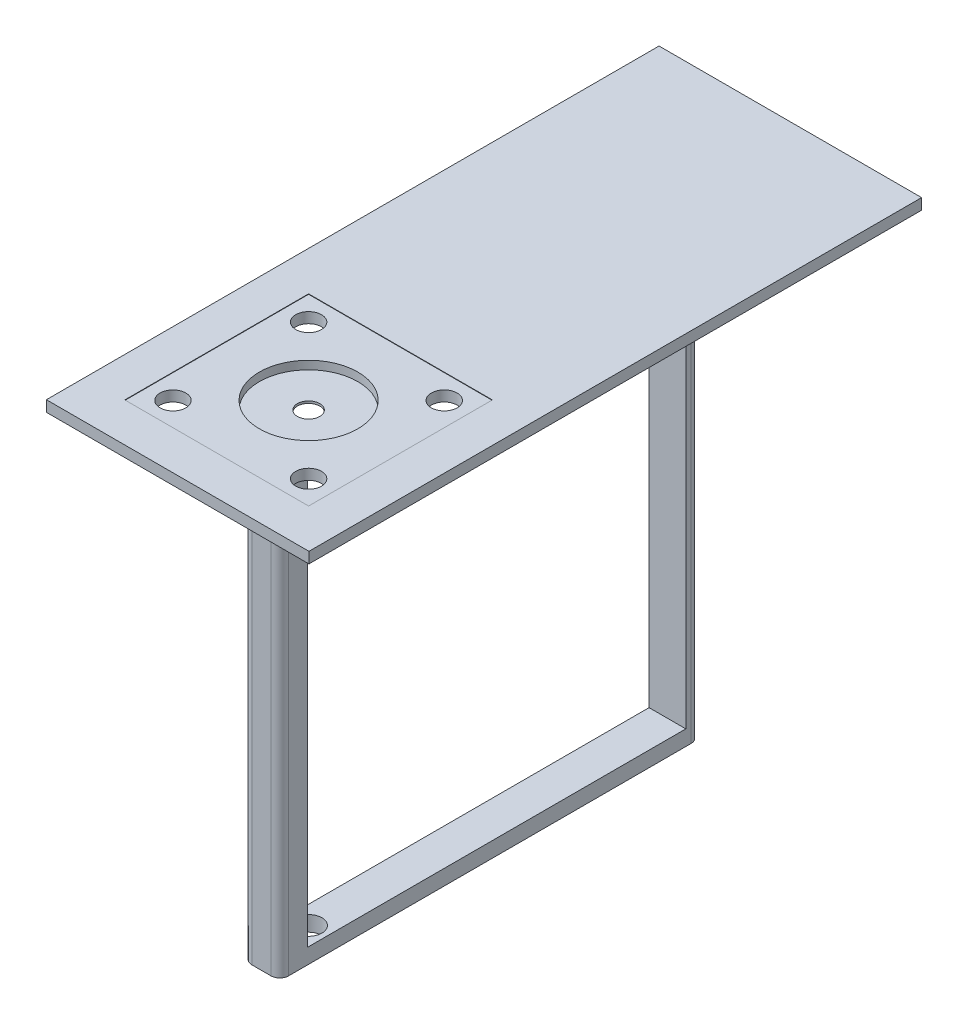
ISO-10303-21;
HEADER;
FILE_DESCRIPTION(('STEP AP214'),'2;1');
FILE_NAME('part.step','',(''),(''),'','','');
FILE_SCHEMA(('AUTOMOTIVE_DESIGN { 1 0 10303 214 1 1 1 1 }'));
ENDSEC;
DATA;
#1=APPLICATION_CONTEXT('core data for automotive mechanical design processes');
#2=APPLICATION_PROTOCOL_DEFINITION('international standard','automotive_design',2000,#1);
#3=PRODUCT_CONTEXT('',#1,'mechanical');
#4=PRODUCT('Part','Part','',(#3));
#5=PRODUCT_RELATED_PRODUCT_CATEGORY('part','',(#4));
#6=PRODUCT_DEFINITION_FORMATION('','',#4);
#7=PRODUCT_DEFINITION_CONTEXT('part definition',#1,'design');
#8=PRODUCT_DEFINITION('design','',#6,#7);
#9=PRODUCT_DEFINITION_SHAPE('','',#8);
#10=(LENGTH_UNIT() NAMED_UNIT(*) SI_UNIT(.MILLI.,.METRE.));
#11=(NAMED_UNIT(*) PLANE_ANGLE_UNIT() SI_UNIT($,.RADIAN.));
#12=(NAMED_UNIT(*) SI_UNIT($,.STERADIAN.) SOLID_ANGLE_UNIT());
#13=UNCERTAINTY_MEASURE_WITH_UNIT(LENGTH_MEASURE(1.E-05),#10,'distance_accuracy_value','');
#14=(GEOMETRIC_REPRESENTATION_CONTEXT(3) GLOBAL_UNCERTAINTY_ASSIGNED_CONTEXT((#13)) GLOBAL_UNIT_ASSIGNED_CONTEXT((#10,
#11,#12)) REPRESENTATION_CONTEXT('',''));
#15=CARTESIAN_POINT('',(0.,0.,0.));
#16=DIRECTION('',(0.,0.,1.));
#17=DIRECTION('',(1.,0.,0.));
#18=AXIS2_PLACEMENT_3D('',#15,#16,#17);
#19=CARTESIAN_POINT('',(-27.8,-26.25,-113.118467464147));
#20=DIRECTION('',(0.,-1.,0.));
#21=DIRECTION('',(0.,0.,-1.));
#22=AXIS2_PLACEMENT_3D('',#19,#20,#21);
#23=CYLINDRICAL_SURFACE('',#22,2.);
#24=CARTESIAN_POINT('',(-27.8,-105.,-113.118467464147));
#25=DIRECTION('',(0.,1.,0.));
#26=DIRECTION('',(1.,0.,0.));
#27=AXIS2_PLACEMENT_3D('',#24,#25,#26);
#28=CIRCLE('',#27,2.);
#29=CARTESIAN_POINT('',(-25.8,-105.,-113.118467464147));
#30=VERTEX_POINT('',#29);
#31=CARTESIAN_POINT('',(-27.8,-105.,-115.118467464147));
#32=VERTEX_POINT('',#31);
#33=EDGE_CURVE('E9',#30,#32,#28,.T.);
#34=ORIENTED_EDGE('',*,*,#33,.T.);
#35=DIRECTION('',(0.,1.,0.));
#36=VECTOR('',#35,1.);
#37=CARTESIAN_POINT('',(-27.8,-26.25,-115.118467464147));
#38=LINE('',#37,#36);
#39=CARTESIAN_POINT('',(-27.8,0.,-115.118467464147));
#40=VERTEX_POINT('',#39);
#41=EDGE_CURVE('E25',#32,#40,#38,.T.);
#42=ORIENTED_EDGE('',*,*,#41,.T.);
#43=CARTESIAN_POINT('',(-27.8,0.,-113.118467464147));
#44=DIRECTION('',(0.,-1.,0.));
#45=DIRECTION('',(1.,0.,0.));
#46=AXIS2_PLACEMENT_3D('',#43,#44,#45);
#47=CIRCLE('',#46,2.);
#48=CARTESIAN_POINT('',(-25.8,0.,-113.118467464147));
#49=VERTEX_POINT('',#48);
#50=EDGE_CURVE('E264',#40,#49,#47,.T.);
#51=ORIENTED_EDGE('',*,*,#50,.T.);
#52=DIRECTION('',(0.,-1.,0.));
#53=VECTOR('',#52,1.);
#54=CARTESIAN_POINT('',(-25.8,-26.25,-113.118467464147));
#55=LINE('',#54,#53);
#56=EDGE_CURVE('E481',#49,#30,#55,.T.);
#57=ORIENTED_EDGE('',*,*,#56,.T.);
#58=EDGE_LOOP('',(#34,#42,#51,#57));
#59=FACE_BOUND('',#58,.T.);
#60=ADVANCED_FACE('F15',(#59),#23,.T.);
#61=CARTESIAN_POINT('',(-33.2,0.,-115.118467464147));
#62=DIRECTION('',(0.,0.,-1.));
#63=DIRECTION('',(-1.,0.,0.));
#64=AXIS2_PLACEMENT_3D('',#61,#62,#63);
#65=PLANE('',#64);
#66=ORIENTED_EDGE('',*,*,#41,.F.);
#67=DIRECTION('',(-1.,0.,0.));
#68=VECTOR('',#67,1.);
#69=CARTESIAN_POINT('',(-33.2,-105.,-115.118467464147));
#70=LINE('',#69,#68);
#71=CARTESIAN_POINT('',(-32.2,-105.,-115.118467464147));
#72=VERTEX_POINT('',#71);
#73=EDGE_CURVE('E269',#32,#72,#70,.T.);
#74=ORIENTED_EDGE('',*,*,#73,.T.);
#75=DIRECTION('',(0.,-1.,0.));
#76=VECTOR('',#75,1.);
#77=CARTESIAN_POINT('',(-32.2,-26.25,-115.118467464147));
#78=LINE('',#77,#76);
#79=CARTESIAN_POINT('',(-32.2,0.,-115.118467464147));
#80=VERTEX_POINT('',#79);
#81=EDGE_CURVE('E266',#80,#72,#78,.T.);
#82=ORIENTED_EDGE('',*,*,#81,.F.);
#83=DIRECTION('',(-1.,0.,0.));
#84=VECTOR('',#83,1.);
#85=CARTESIAN_POINT('',(-28.4,0.,-115.118467464147));
#86=LINE('',#85,#84);
#87=EDGE_CURVE('E257',#40,#80,#86,.T.);
#88=ORIENTED_EDGE('',*,*,#87,.F.);
#89=EDGE_LOOP('',(#66,#74,#82,#88));
#90=FACE_BOUND('',#89,.T.);
#91=ADVANCED_FACE('F267',(#90),#65,.T.);
#92=CARTESIAN_POINT('',(-30.,-105.,-113.518467464147));
#93=DIRECTION('',(0.,-1.,0.));
#94=DIRECTION('',(0.,0.,-1.));
#95=AXIS2_PLACEMENT_3D('',#92,#93,#94);
#96=PLANE('',#95);
#97=CARTESIAN_POINT('',(-30.,-105.,-29.9184674641469));
#98=DIRECTION('',(0.,1.,0.));
#99=DIRECTION('',(1.,0.,0.));
#100=AXIS2_PLACEMENT_3D('',#97,#98,#99);
#101=CIRCLE('',#100,3.05);
#102=CARTESIAN_POINT('',(-26.95,-105.,-29.9184674641469));
#103=VERTEX_POINT('',#102);
#104=EDGE_CURVE('E482',#103,#103,#101,.T.);
#105=ORIENTED_EDGE('',*,*,#104,.T.);
#106=EDGE_LOOP('',(#105));
#107=FACE_BOUND('',#106,.T.);
#108=ORIENTED_EDGE('',*,*,#33,.F.);
#109=DIRECTION('',(0.,0.,1.));
#110=VECTOR('',#109,1.);
#111=CARTESIAN_POINT('',(-25.8,-105.,-115.118467464147));
#112=LINE('',#111,#110);
#113=CARTESIAN_POINT('',(-25.8,-105.,-21.1331765547648));
#114=VERTEX_POINT('',#113);
#115=EDGE_CURVE('E475',#30,#114,#112,.T.);
#116=ORIENTED_EDGE('',*,*,#115,.T.);
#117=CARTESIAN_POINT('',(-27.8,-105.,-21.1331765547648));
#118=DIRECTION('',(0.,1.,0.));
#119=DIRECTION('',(1.,0.,0.));
#120=AXIS2_PLACEMENT_3D('',#117,#118,#119);
#121=CIRCLE('',#120,2.);
#122=CARTESIAN_POINT('',(-27.8,-105.,-19.1331765547648));
#123=VERTEX_POINT('',#122);
#124=EDGE_CURVE('E302',#123,#114,#121,.T.);
#125=ORIENTED_EDGE('',*,*,#124,.F.);
#126=DIRECTION('',(-1.,0.,0.));
#127=VECTOR('',#126,1.);
#128=CARTESIAN_POINT('',(-27.8999999999996,-105.,-19.1331765547648));
#129=LINE('',#128,#127);
#130=CARTESIAN_POINT('',(-32.2,-105.,-19.1331765547648));
#131=VERTEX_POINT('',#130);
#132=EDGE_CURVE('E472',#123,#131,#129,.T.);
#133=ORIENTED_EDGE('',*,*,#132,.T.);
#134=CARTESIAN_POINT('',(-32.2,-105.,-21.1331765547648));
#135=DIRECTION('',(0.,1.,0.));
#136=DIRECTION('',(1.,0.,0.));
#137=AXIS2_PLACEMENT_3D('',#134,#135,#136);
#138=CIRCLE('',#137,2.);
#139=CARTESIAN_POINT('',(-34.2,-105.,-21.1331765547648));
#140=VERTEX_POINT('',#139);
#141=EDGE_CURVE('E313',#140,#131,#138,.T.);
#142=ORIENTED_EDGE('',*,*,#141,.F.);
#143=DIRECTION('',(0.,0.,1.));
#144=VECTOR('',#143,1.);
#145=CARTESIAN_POINT('',(-34.2,-105.,-115.118467464147));
#146=LINE('',#145,#144);
#147=CARTESIAN_POINT('',(-34.2,-105.,-113.118467464147));
#148=VERTEX_POINT('',#147);
#149=EDGE_CURVE('E273',#148,#140,#146,.T.);
#150=ORIENTED_EDGE('',*,*,#149,.F.);
#151=CARTESIAN_POINT('',(-32.2,-105.,-113.118467464147));
#152=DIRECTION('',(0.,1.,0.));
#153=DIRECTION('',(1.,0.,0.));
#154=AXIS2_PLACEMENT_3D('',#151,#152,#153);
#155=CIRCLE('',#154,2.);
#156=EDGE_CURVE('E280',#72,#148,#155,.T.);
#157=ORIENTED_EDGE('',*,*,#156,.F.);
#158=ORIENTED_EDGE('',*,*,#73,.F.);
#159=EDGE_LOOP('',(#108,#116,#125,#133,#142,#150,#157,#158));
#160=FACE_BOUND('',#159,.T.);
#161=ADVANCED_FACE('F389',(#107,#160),#96,.T.);
#162=CARTESIAN_POINT('',(-32.2,-26.25,-113.118467464147));
#163=DIRECTION('',(0.,-1.,0.));
#164=DIRECTION('',(0.,0.,-1.));
#165=AXIS2_PLACEMENT_3D('',#162,#163,#164);
#166=CYLINDRICAL_SURFACE('',#165,2.);
#167=ORIENTED_EDGE('',*,*,#156,.T.);
#168=DIRECTION('',(0.,1.,0.));
#169=VECTOR('',#168,1.);
#170=CARTESIAN_POINT('',(-34.2,-26.25,-113.118467464147));
#171=LINE('',#170,#169);
#172=CARTESIAN_POINT('',(-34.2,0.,-113.118467464147));
#173=VERTEX_POINT('',#172);
#174=EDGE_CURVE('E277',#148,#173,#171,.T.);
#175=ORIENTED_EDGE('',*,*,#174,.T.);
#176=CARTESIAN_POINT('',(-32.2,0.,-113.118467464147));
#177=DIRECTION('',(0.,-1.,0.));
#178=DIRECTION('',(1.,0.,0.));
#179=AXIS2_PLACEMENT_3D('',#176,#177,#178);
#180=CIRCLE('',#179,2.);
#181=EDGE_CURVE('E260',#173,#80,#180,.T.);
#182=ORIENTED_EDGE('',*,*,#181,.T.);
#183=ORIENTED_EDGE('',*,*,#81,.T.);
#184=EDGE_LOOP('',(#167,#175,#182,#183));
#185=FACE_BOUND('',#184,.T.);
#186=ADVANCED_FACE('F275',(#185),#166,.T.);
#187=CARTESIAN_POINT('',(-34.2,-52.5,-65.0184674641469));
#188=DIRECTION('',(-1.,0.,0.));
#189=DIRECTION('',(0.,0.,1.));
#190=AXIS2_PLACEMENT_3D('',#187,#188,#189);
#191=PLANE('',#190);
#192=ORIENTED_EDGE('',*,*,#174,.F.);
#193=ORIENTED_EDGE('',*,*,#149,.T.);
#194=DIRECTION('',(0.,-1.,0.));
#195=VECTOR('',#194,1.);
#196=CARTESIAN_POINT('',(-34.2,-78.75,-21.1331765547648));
#197=LINE('',#196,#195);
#198=CARTESIAN_POINT('',(-34.2,0.,-21.1331765547648));
#199=VERTEX_POINT('',#198);
#200=EDGE_CURVE('E284',#199,#140,#197,.T.);
#201=ORIENTED_EDGE('',*,*,#200,.F.);
#202=DIRECTION('',(0.,0.,1.));
#203=VECTOR('',#202,1.);
#204=CARTESIAN_POINT('',(-34.2,0.,-47.7090882773824));
#205=LINE('',#204,#203);
#206=CARTESIAN_POINT('',(-34.2,0.,-25.4181765547648));
#207=VERTEX_POINT('',#206);
#208=EDGE_CURVE('E289',#207,#199,#205,.T.);
#209=ORIENTED_EDGE('',*,*,#208,.F.);
#210=DIRECTION('',(0.,1.,0.));
#211=VECTOR('',#210,1.);
#212=CARTESIAN_POINT('',(-34.2,-101.5,-25.4181765547648));
#213=LINE('',#212,#211);
#214=CARTESIAN_POINT('',(-34.2,-101.5,-25.4181765547648));
#215=VERTEX_POINT('',#214);
#216=EDGE_CURVE('E288',#215,#207,#213,.T.);
#217=ORIENTED_EDGE('',*,*,#216,.F.);
#218=DIRECTION('',(0.,0.,-1.));
#219=VECTOR('',#218,1.);
#220=CARTESIAN_POINT('',(-34.2,-101.5,-19.1331765547648));
#221=LINE('',#220,#219);
#222=CARTESIAN_POINT('',(-34.2,-101.5,-111.918467464147));
#223=VERTEX_POINT('',#222);
#224=EDGE_CURVE('E296',#215,#223,#221,.T.);
#225=ORIENTED_EDGE('',*,*,#224,.T.);
#226=DIRECTION('',(0.,1.,0.));
#227=VECTOR('',#226,1.);
#228=CARTESIAN_POINT('',(-34.2,-101.5,-111.918467464147));
#229=LINE('',#228,#227);
#230=CARTESIAN_POINT('',(-34.2,0.,-111.918467464147));
#231=VERTEX_POINT('',#230);
#232=EDGE_CURVE('E299',#223,#231,#229,.T.);
#233=ORIENTED_EDGE('',*,*,#232,.T.);
#234=DIRECTION('',(0.,0.,1.));
#235=VECTOR('',#234,1.);
#236=CARTESIAN_POINT('',(-34.2,0.,-67.5092337320734));
#237=LINE('',#236,#235);
#238=EDGE_CURVE('E194',#173,#231,#237,.T.);
#239=ORIENTED_EDGE('',*,*,#238,.F.);
#240=EDGE_LOOP('',(#192,#193,#201,#209,#217,#225,#233,#239));
#241=FACE_BOUND('',#240,.T.);
#242=ADVANCED_FACE('F396',(#241),#191,.T.);
#243=CARTESIAN_POINT('',(-27.8,-78.75,-21.1331765547648));
#244=DIRECTION('',(0.,1.,0.));
#245=DIRECTION('',(1.,0.,0.));
#246=AXIS2_PLACEMENT_3D('',#243,#244,#245);
#247=CYLINDRICAL_SURFACE('',#246,2.);
#248=ORIENTED_EDGE('',*,*,#124,.T.);
#249=DIRECTION('',(0.,1.,0.));
#250=VECTOR('',#249,1.);
#251=CARTESIAN_POINT('',(-25.8,-78.75,-21.1331765547648));
#252=LINE('',#251,#250);
#253=CARTESIAN_POINT('',(-25.8,0.,-21.1331765547648));
#254=VERTEX_POINT('',#253);
#255=EDGE_CURVE('E304',#114,#254,#252,.T.);
#256=ORIENTED_EDGE('',*,*,#255,.T.);
#257=CARTESIAN_POINT('',(-27.8,0.,-21.1331765547648));
#258=DIRECTION('',(0.,-1.,0.));
#259=DIRECTION('',(1.,0.,0.));
#260=AXIS2_PLACEMENT_3D('',#257,#258,#259);
#261=CIRCLE('',#260,2.);
#262=CARTESIAN_POINT('',(-27.8,0.,-19.1331765547648));
#263=VERTEX_POINT('',#262);
#264=EDGE_CURVE('E307',#254,#263,#261,.T.);
#265=ORIENTED_EDGE('',*,*,#264,.T.);
#266=DIRECTION('',(0.,-1.,0.));
#267=VECTOR('',#266,1.);
#268=CARTESIAN_POINT('',(-27.8,-78.75,-19.1331765547648));
#269=LINE('',#268,#267);
#270=EDGE_CURVE('E310',#263,#123,#269,.T.);
#271=ORIENTED_EDGE('',*,*,#270,.T.);
#272=EDGE_LOOP('',(#248,#256,#265,#271));
#273=FACE_BOUND('',#272,.T.);
#274=ADVANCED_FACE('F17',(#273),#247,.T.);
#275=CARTESIAN_POINT('',(-25.8,-105.,-19.1331765547649));
#276=DIRECTION('',(0.,0.,-1.));
#277=DIRECTION('',(-1.,0.,0.));
#278=AXIS2_PLACEMENT_3D('',#275,#276,#277);
#279=PLANE('',#278);
#280=ORIENTED_EDGE('',*,*,#270,.F.);
#281=DIRECTION('',(1.,0.,0.));
#282=VECTOR('',#281,1.);
#283=CARTESIAN_POINT('',(-32.1,0.,-19.1331765547648));
#284=LINE('',#283,#282);
#285=CARTESIAN_POINT('',(-32.2,0.,-19.1331765547648));
#286=VERTEX_POINT('',#285);
#287=EDGE_CURVE('E292',#286,#263,#284,.T.);
#288=ORIENTED_EDGE('',*,*,#287,.F.);
#289=DIRECTION('',(0.,1.,0.));
#290=VECTOR('',#289,1.);
#291=CARTESIAN_POINT('',(-32.2,-78.75,-19.1331765547648));
#292=LINE('',#291,#290);
#293=EDGE_CURVE('E317',#131,#286,#292,.T.);
#294=ORIENTED_EDGE('',*,*,#293,.F.);
#295=ORIENTED_EDGE('',*,*,#132,.F.);
#296=EDGE_LOOP('',(#280,#288,#294,#295));
#297=FACE_BOUND('',#296,.T.);
#298=ADVANCED_FACE('F454',(#297),#279,.F.);
#299=CARTESIAN_POINT('',(-32.2,-78.75,-21.1331765547648));
#300=DIRECTION('',(0.,1.,0.));
#301=DIRECTION('',(1.,0.,0.));
#302=AXIS2_PLACEMENT_3D('',#299,#300,#301);
#303=CYLINDRICAL_SURFACE('',#302,2.);
#304=ORIENTED_EDGE('',*,*,#141,.T.);
#305=ORIENTED_EDGE('',*,*,#293,.T.);
#306=CARTESIAN_POINT('',(-32.2,0.,-21.1331765547648));
#307=DIRECTION('',(0.,-1.,0.));
#308=DIRECTION('',(1.,0.,0.));
#309=AXIS2_PLACEMENT_3D('',#306,#307,#308);
#310=CIRCLE('',#309,2.);
#311=EDGE_CURVE('E287',#286,#199,#310,.T.);
#312=ORIENTED_EDGE('',*,*,#311,.T.);
#313=ORIENTED_EDGE('',*,*,#200,.T.);
#314=EDGE_LOOP('',(#304,#305,#312,#313));
#315=FACE_BOUND('',#314,.T.);
#316=ADVANCED_FACE('F451',(#315),#303,.T.);
#317=CARTESIAN_POINT('',(-25.8,-101.5,-25.4181765547648));
#318=DIRECTION('',(0.,0.,-1.));
#319=DIRECTION('',(-1.,0.,0.));
#320=AXIS2_PLACEMENT_3D('',#317,#318,#319);
#321=PLANE('',#320);
#322=DIRECTION('',(-1.,0.,0.));
#323=VECTOR('',#322,1.);
#324=CARTESIAN_POINT('',(-27.9,0.,-25.4181765547648));
#325=LINE('',#324,#323);
#326=CARTESIAN_POINT('',(-25.8,0.,-25.4181765547648));
#327=VERTEX_POINT('',#326);
#328=EDGE_CURVE('E291',#327,#207,#325,.T.);
#329=ORIENTED_EDGE('',*,*,#328,.F.);
#330=DIRECTION('',(0.,1.,0.));
#331=VECTOR('',#330,1.);
#332=CARTESIAN_POINT('',(-25.8,-101.5,-25.4181765547648));
#333=LINE('',#332,#331);
#334=CARTESIAN_POINT('',(-25.8,-101.5,-25.4181765547648));
#335=VERTEX_POINT('',#334);
#336=EDGE_CURVE('E325',#335,#327,#333,.T.);
#337=ORIENTED_EDGE('',*,*,#336,.F.);
#338=DIRECTION('',(1.,0.,0.));
#339=VECTOR('',#338,1.);
#340=CARTESIAN_POINT('',(-27.9,-101.5,-25.4181765547648));
#341=LINE('',#340,#339);
#342=EDGE_CURVE('E329',#215,#335,#341,.T.);
#343=ORIENTED_EDGE('',*,*,#342,.F.);
#344=ORIENTED_EDGE('',*,*,#216,.T.);
#345=EDGE_LOOP('',(#329,#337,#343,#344));
#346=FACE_BOUND('',#345,.T.);
#347=ADVANCED_FACE('F453',(#346),#321,.T.);
#348=CARTESIAN_POINT('',(-30.,-101.5,-63.4184674641469));
#349=DIRECTION('',(0.,-1.,0.));
#350=DIRECTION('',(0.,0.,-1.));
#351=AXIS2_PLACEMENT_3D('',#348,#349,#350);
#352=PLANE('',#351);
#353=CARTESIAN_POINT('',(-30.,-101.5,-29.9184674641469));
#354=DIRECTION('',(0.,-1.,0.));
#355=DIRECTION('',(0.,0.,-1.));
#356=AXIS2_PLACEMENT_3D('',#353,#354,#355);
#357=CIRCLE('',#356,3.05);
#358=CARTESIAN_POINT('',(-30.,-101.5,-32.9684674641469));
#359=VERTEX_POINT('',#358);
#360=EDGE_CURVE('E295',#359,#359,#357,.T.);
#361=ORIENTED_EDGE('',*,*,#360,.T.);
#362=EDGE_LOOP('',(#361));
#363=FACE_BOUND('',#362,.T.);
#364=ORIENTED_EDGE('',*,*,#342,.T.);
#365=DIRECTION('',(0.,0.,-1.));
#366=VECTOR('',#365,1.);
#367=CARTESIAN_POINT('',(-25.8,-101.5,-19.1331765547648));
#368=LINE('',#367,#366);
#369=CARTESIAN_POINT('',(-25.8,-101.5,-111.918467464147));
#370=VERTEX_POINT('',#369);
#371=EDGE_CURVE('E332',#335,#370,#368,.T.);
#372=ORIENTED_EDGE('',*,*,#371,.T.);
#373=DIRECTION('',(1.,0.,0.));
#374=VECTOR('',#373,1.);
#375=CARTESIAN_POINT('',(-28.4,-101.5,-111.918467464147));
#376=LINE('',#375,#374);
#377=EDGE_CURVE('E338',#223,#370,#376,.T.);
#378=ORIENTED_EDGE('',*,*,#377,.F.);
#379=ORIENTED_EDGE('',*,*,#224,.F.);
#380=EDGE_LOOP('',(#364,#372,#378,#379));
#381=FACE_BOUND('',#380,.T.);
#382=ADVANCED_FACE('F449',(#363,#381),#352,.F.);
#383=CARTESIAN_POINT('',(-30.,2.5,-29.9184674641469));
#384=DIRECTION('',(0.,-1.,0.));
#385=DIRECTION('',(0.,0.,-1.));
#386=AXIS2_PLACEMENT_3D('',#383,#384,#385);
#387=CYLINDRICAL_SURFACE('',#386,11.25);
#388=CARTESIAN_POINT('',(-30.,2.4,-29.9184674641469));
#389=DIRECTION('',(0.,-1.,0.));
#390=DIRECTION('',(0.,0.,-1.));
#391=AXIS2_PLACEMENT_3D('',#388,#389,#390);
#392=CIRCLE('',#391,11.25);
#393=CARTESIAN_POINT('',(-30.,2.4,-41.1684674641469));
#394=VERTEX_POINT('',#393);
#395=EDGE_CURVE('E212',#394,#394,#392,.T.);
#396=ORIENTED_EDGE('',*,*,#395,.F.);
#397=EDGE_LOOP('',(#396));
#398=FACE_BOUND('',#397,.T.);
#399=CARTESIAN_POINT('',(-30.,0.5,-29.9184674641469));
#400=DIRECTION('',(0.,-1.,0.));
#401=DIRECTION('',(0.,0.,-1.));
#402=AXIS2_PLACEMENT_3D('',#399,#400,#401);
#403=CIRCLE('',#402,11.25);
#404=CARTESIAN_POINT('',(-30.,0.5,-41.1684674641469));
#405=VERTEX_POINT('',#404);
#406=EDGE_CURVE('E337',#405,#405,#403,.T.);
#407=ORIENTED_EDGE('',*,*,#406,.T.);
#408=EDGE_LOOP('',(#407));
#409=FACE_BOUND('',#408,.T.);
#410=ADVANCED_FACE('F447',(#398,#409),#387,.F.);
#411=CARTESIAN_POINT('',(-30.,0.5,-29.9184674641469));
#412=DIRECTION('',(0.,1.,0.));
#413=DIRECTION('',(0.,0.,1.));
#414=AXIS2_PLACEMENT_3D('',#411,#412,#413);
#415=PLANE('',#414);
#416=ORIENTED_EDGE('',*,*,#406,.F.);
#417=EDGE_LOOP('',(#416));
#418=FACE_BOUND('',#417,.T.);
#419=CARTESIAN_POINT('',(-30.,0.5,-29.9184674641469));
#420=DIRECTION('',(0.,1.,0.));
#421=DIRECTION('',(1.,0.,0.));
#422=AXIS2_PLACEMENT_3D('',#419,#420,#421);
#423=CIRCLE('',#422,2.55);
#424=CARTESIAN_POINT('',(-27.45,0.5,-29.9184674641469));
#425=VERTEX_POINT('',#424);
#426=EDGE_CURVE('E328',#425,#425,#423,.T.);
#427=ORIENTED_EDGE('',*,*,#426,.F.);
#428=EDGE_LOOP('',(#427));
#429=FACE_BOUND('',#428,.T.);
#430=ADVANCED_FACE('F400',(#418,#429),#415,.T.);
#431=CARTESIAN_POINT('',(-30.,2.5,-29.9184674641469));
#432=DIRECTION('',(0.,-1.,0.));
#433=DIRECTION('',(0.,0.,-1.));
#434=AXIS2_PLACEMENT_3D('',#431,#432,#433);
#435=CYLINDRICAL_SURFACE('',#434,2.55);
#436=ORIENTED_EDGE('',*,*,#426,.T.);
#437=EDGE_LOOP('',(#436));
#438=FACE_BOUND('',#437,.T.);
#439=CARTESIAN_POINT('',(-30.,0.,-29.9184674641469));
#440=DIRECTION('',(0.,1.,0.));
#441=DIRECTION('',(1.,0.,0.));
#442=AXIS2_PLACEMENT_3D('',#439,#440,#441);
#443=CIRCLE('',#442,2.55);
#444=CARTESIAN_POINT('',(-27.45,0.,-29.9184674641469));
#445=VERTEX_POINT('',#444);
#446=EDGE_CURVE('E316',#445,#445,#443,.T.);
#447=ORIENTED_EDGE('',*,*,#446,.F.);
#448=EDGE_LOOP('',(#447));
#449=FACE_BOUND('',#448,.T.);
#450=ADVANCED_FACE('F397',(#438,#449),#435,.F.);
#451=CARTESIAN_POINT('',(-25.8,-52.5,-65.0184674641469));
#452=DIRECTION('',(1.,0.,0.));
#453=DIRECTION('',(0.,0.,-1.));
#454=AXIS2_PLACEMENT_3D('',#451,#452,#453);
#455=PLANE('',#454);
#456=ORIENTED_EDGE('',*,*,#56,.F.);
#457=DIRECTION('',(0.,0.,-1.));
#458=VECTOR('',#457,1.);
#459=CARTESIAN_POINT('',(-25.8,0.,-67.5092337320734));
#460=LINE('',#459,#458);
#461=CARTESIAN_POINT('',(-25.8,0.,-111.918467464147));
#462=VERTEX_POINT('',#461);
#463=EDGE_CURVE('E195',#462,#49,#460,.T.);
#464=ORIENTED_EDGE('',*,*,#463,.F.);
#465=DIRECTION('',(0.,1.,0.));
#466=VECTOR('',#465,1.);
#467=CARTESIAN_POINT('',(-25.8,-101.5,-111.918467464147));
#468=LINE('',#467,#466);
#469=EDGE_CURVE('E199',#370,#462,#468,.T.);
#470=ORIENTED_EDGE('',*,*,#469,.F.);
#471=ORIENTED_EDGE('',*,*,#371,.F.);
#472=ORIENTED_EDGE('',*,*,#336,.T.);
#473=DIRECTION('',(0.,0.,-1.));
#474=VECTOR('',#473,1.);
#475=CARTESIAN_POINT('',(-25.8,0.,-44.5665882773824));
#476=LINE('',#475,#474);
#477=EDGE_CURVE('E324',#254,#327,#476,.T.);
#478=ORIENTED_EDGE('',*,*,#477,.F.);
#479=ORIENTED_EDGE('',*,*,#255,.F.);
#480=ORIENTED_EDGE('',*,*,#115,.F.);
#481=EDGE_LOOP('',(#456,#464,#470,#471,#472,#478,#479,#480));
#482=FACE_BOUND('',#481,.T.);
#483=ADVANCED_FACE('F254',(#482),#455,.T.);
#484=CARTESIAN_POINT('',(-30.,0.,-70.));
#485=DIRECTION('',(0.,1.,0.));
#486=DIRECTION('',(0.,0.,1.));
#487=AXIS2_PLACEMENT_3D('',#484,#485,#486);
#488=PLANE('',#487);
#489=ORIENTED_EDGE('',*,*,#477,.T.);
#490=ORIENTED_EDGE('',*,*,#328,.T.);
#491=ORIENTED_EDGE('',*,*,#208,.T.);
#492=ORIENTED_EDGE('',*,*,#311,.F.);
#493=ORIENTED_EDGE('',*,*,#287,.T.);
#494=ORIENTED_EDGE('',*,*,#264,.F.);
#495=EDGE_LOOP('',(#489,#490,#491,#492,#493,#494));
#496=FACE_BOUND('',#495,.T.);
#497=ORIENTED_EDGE('',*,*,#446,.T.);
#498=EDGE_LOOP('',(#497));
#499=FACE_BOUND('',#498,.T.);
#500=CARTESIAN_POINT('',(-45.5,0.,-14.4184674641469));
#501=DIRECTION('',(0.,1.,0.));
#502=DIRECTION('',(1.,0.,0.));
#503=AXIS2_PLACEMENT_3D('',#500,#501,#502);
#504=CIRCLE('',#503,2.94329154531918);
#505=CARTESIAN_POINT('',(-42.5567084546808,0.,-14.4184674641469));
#506=VERTEX_POINT('',#505);
#507=EDGE_CURVE('E348',#506,#506,#504,.T.);
#508=ORIENTED_EDGE('',*,*,#507,.T.);
#509=EDGE_LOOP('',(#508));
#510=FACE_BOUND('',#509,.T.);
#511=CARTESIAN_POINT('',(-45.5,0.,-45.4184674641469));
#512=DIRECTION('',(0.,1.,0.));
#513=DIRECTION('',(1.,0.,0.));
#514=AXIS2_PLACEMENT_3D('',#511,#512,#513);
#515=CIRCLE('',#514,2.94329154531918);
#516=CARTESIAN_POINT('',(-42.5567084546808,0.,-45.4184674641469));
#517=VERTEX_POINT('',#516);
#518=EDGE_CURVE('E355',#517,#517,#515,.T.);
#519=ORIENTED_EDGE('',*,*,#518,.T.);
#520=EDGE_LOOP('',(#519));
#521=FACE_BOUND('',#520,.T.);
#522=CARTESIAN_POINT('',(-14.5,0.,-14.4184674641469));
#523=DIRECTION('',(0.,1.,0.));
#524=DIRECTION('',(1.,0.,0.));
#525=AXIS2_PLACEMENT_3D('',#522,#523,#524);
#526=CIRCLE('',#525,2.94329154531918);
#527=CARTESIAN_POINT('',(-11.5567084546808,0.,-14.4184674641469));
#528=VERTEX_POINT('',#527);
#529=EDGE_CURVE('E357',#528,#528,#526,.T.);
#530=ORIENTED_EDGE('',*,*,#529,.T.);
#531=EDGE_LOOP('',(#530));
#532=FACE_BOUND('',#531,.T.);
#533=CARTESIAN_POINT('',(-14.5,0.,-45.4184674641469));
#534=DIRECTION('',(0.,1.,0.));
#535=DIRECTION('',(1.,0.,0.));
#536=AXIS2_PLACEMENT_3D('',#533,#534,#535);
#537=CIRCLE('',#536,2.94329154531918);
#538=CARTESIAN_POINT('',(-11.5567084546808,0.,-45.4184674641469));
#539=VERTEX_POINT('',#538);
#540=EDGE_CURVE('E188',#539,#539,#537,.T.);
#541=ORIENTED_EDGE('',*,*,#540,.T.);
#542=EDGE_LOOP('',(#541));
#543=FACE_BOUND('',#542,.T.);
#544=DIRECTION('',(-1.,0.,0.));
#545=VECTOR('',#544,1.);
#546=CARTESIAN_POINT('',(0.,0.,-140.));
#547=LINE('',#546,#545);
#548=CARTESIAN_POINT('',(0.,0.,-140.));
#549=VERTEX_POINT('',#548);
#550=CARTESIAN_POINT('',(-60.,0.,-140.));
#551=VERTEX_POINT('',#550);
#552=EDGE_CURVE('E180',#549,#551,#547,.T.);
#553=ORIENTED_EDGE('',*,*,#552,.F.);
#554=DIRECTION('',(0.,0.,-1.));
#555=VECTOR('',#554,1.);
#556=CARTESIAN_POINT('',(0.,0.,0.));
#557=LINE('',#556,#555);
#558=CARTESIAN_POINT('',(0.,0.,0.));
#559=VERTEX_POINT('',#558);
#560=EDGE_CURVE('E164',#559,#549,#557,.T.);
#561=ORIENTED_EDGE('',*,*,#560,.F.);
#562=DIRECTION('',(1.,0.,0.));
#563=VECTOR('',#562,1.);
#564=CARTESIAN_POINT('',(-60.,0.,0.));
#565=LINE('',#564,#563);
#566=CARTESIAN_POINT('',(-60.,0.,0.));
#567=VERTEX_POINT('',#566);
#568=EDGE_CURVE('E172',#567,#559,#565,.T.);
#569=ORIENTED_EDGE('',*,*,#568,.F.);
#570=DIRECTION('',(0.,0.,1.));
#571=VECTOR('',#570,1.);
#572=CARTESIAN_POINT('',(-60.,0.,-140.));
#573=LINE('',#572,#571);
#574=EDGE_CURVE('E174',#551,#567,#573,.T.);
#575=ORIENTED_EDGE('',*,*,#574,.F.);
#576=EDGE_LOOP('',(#553,#561,#569,#575));
#577=FACE_BOUND('',#576,.T.);
#578=ORIENTED_EDGE('',*,*,#87,.T.);
#579=ORIENTED_EDGE('',*,*,#181,.F.);
#580=ORIENTED_EDGE('',*,*,#238,.T.);
#581=DIRECTION('',(1.,0.,0.));
#582=VECTOR('',#581,1.);
#583=CARTESIAN_POINT('',(-28.4,0.,-111.918467464147));
#584=LINE('',#583,#582);
#585=EDGE_CURVE('E191',#231,#462,#584,.T.);
#586=ORIENTED_EDGE('',*,*,#585,.T.);
#587=ORIENTED_EDGE('',*,*,#463,.T.);
#588=ORIENTED_EDGE('',*,*,#50,.F.);
#589=EDGE_LOOP('',(#578,#579,#580,#586,#587,#588));
#590=FACE_BOUND('',#589,.T.);
#591=ADVANCED_FACE('F250',(#496,#499,#510,#521,#532,#543,#577,#590),#488,.F.);
#592=CARTESIAN_POINT('',(-30.,-105.,-29.9184674641469));
#593=DIRECTION('',(0.,1.,0.));
#594=DIRECTION('',(1.,0.,0.));
#595=AXIS2_PLACEMENT_3D('',#592,#593,#594);
#596=CYLINDRICAL_SURFACE('',#595,3.05);
#597=ORIENTED_EDGE('',*,*,#104,.F.);
#598=EDGE_LOOP('',(#597));
#599=FACE_BOUND('',#598,.T.);
#600=ORIENTED_EDGE('',*,*,#360,.F.);
#601=EDGE_LOOP('',(#600));
#602=FACE_BOUND('',#601,.T.);
#603=ADVANCED_FACE('F253',(#599,#602),#596,.F.);
#604=CARTESIAN_POINT('',(-26.8,0.,-111.918467464147));
#605=DIRECTION('',(0.,0.,1.));
#606=DIRECTION('',(1.,0.,0.));
#607=AXIS2_PLACEMENT_3D('',#604,#605,#606);
#608=PLANE('',#607);
#609=ORIENTED_EDGE('',*,*,#377,.T.);
#610=ORIENTED_EDGE('',*,*,#469,.T.);
#611=ORIENTED_EDGE('',*,*,#585,.F.);
#612=ORIENTED_EDGE('',*,*,#232,.F.);
#613=EDGE_LOOP('',(#609,#610,#611,#612));
#614=FACE_BOUND('',#613,.T.);
#615=ADVANCED_FACE('F403',(#614),#608,.T.);
#616=CARTESIAN_POINT('',(-45.5,2.5,-14.4184674641469));
#617=DIRECTION('',(0.,-1.,0.));
#618=DIRECTION('',(0.,0.,-1.));
#619=AXIS2_PLACEMENT_3D('',#616,#617,#618);
#620=CYLINDRICAL_SURFACE('',#619,2.94329154531918);
#621=CARTESIAN_POINT('',(-45.5,2.4,-14.4184674641469));
#622=DIRECTION('',(0.,1.,0.));
#623=DIRECTION('',(1.,0.,0.));
#624=AXIS2_PLACEMENT_3D('',#621,#622,#623);
#625=CIRCLE('',#624,2.94329154531918);
#626=CARTESIAN_POINT('',(-42.5567084546808,2.4,-14.4184674641469));
#627=VERTEX_POINT('',#626);
#628=EDGE_CURVE('E196',#627,#627,#625,.T.);
#629=ORIENTED_EDGE('',*,*,#628,.T.);
#630=EDGE_LOOP('',(#629));
#631=FACE_BOUND('',#630,.T.);
#632=ORIENTED_EDGE('',*,*,#507,.F.);
#633=EDGE_LOOP('',(#632));
#634=FACE_BOUND('',#633,.T.);
#635=ADVANCED_FACE('F406',(#631,#634),#620,.F.);
#636=CARTESIAN_POINT('',(-45.5,2.5,-45.4184674641469));
#637=DIRECTION('',(0.,-1.,0.));
#638=DIRECTION('',(0.,0.,-1.));
#639=AXIS2_PLACEMENT_3D('',#636,#637,#638);
#640=CYLINDRICAL_SURFACE('',#639,2.94329154531918);
#641=CARTESIAN_POINT('',(-45.5,2.4,-45.4184674641469));
#642=DIRECTION('',(0.,1.,0.));
#643=DIRECTION('',(1.,0.,0.));
#644=AXIS2_PLACEMENT_3D('',#641,#642,#643);
#645=CIRCLE('',#644,2.94329154531918);
#646=CARTESIAN_POINT('',(-42.5567084546808,2.4,-45.4184674641469));
#647=VERTEX_POINT('',#646);
#648=EDGE_CURVE('E200',#647,#647,#645,.T.);
#649=ORIENTED_EDGE('',*,*,#648,.T.);
#650=EDGE_LOOP('',(#649));
#651=FACE_BOUND('',#650,.T.);
#652=ORIENTED_EDGE('',*,*,#518,.F.);
#653=EDGE_LOOP('',(#652));
#654=FACE_BOUND('',#653,.T.);
#655=ADVANCED_FACE('F379',(#651,#654),#640,.F.);
#656=CARTESIAN_POINT('',(-14.5,2.5,-14.4184674641469));
#657=DIRECTION('',(0.,-1.,0.));
#658=DIRECTION('',(0.,0.,-1.));
#659=AXIS2_PLACEMENT_3D('',#656,#657,#658);
#660=CYLINDRICAL_SURFACE('',#659,2.94329154531918);
#661=CARTESIAN_POINT('',(-14.5,2.4,-14.4184674641469));
#662=DIRECTION('',(0.,1.,0.));
#663=DIRECTION('',(1.,0.,0.));
#664=AXIS2_PLACEMENT_3D('',#661,#662,#663);
#665=CIRCLE('',#664,2.94329154531918);
#666=CARTESIAN_POINT('',(-11.5567084546808,2.4,-14.4184674641469));
#667=VERTEX_POINT('',#666);
#668=EDGE_CURVE('E203',#667,#667,#665,.T.);
#669=ORIENTED_EDGE('',*,*,#668,.T.);
#670=EDGE_LOOP('',(#669));
#671=FACE_BOUND('',#670,.T.);
#672=ORIENTED_EDGE('',*,*,#529,.F.);
#673=EDGE_LOOP('',(#672));
#674=FACE_BOUND('',#673,.T.);
#675=ADVANCED_FACE('F368',(#671,#674),#660,.F.);
#676=CARTESIAN_POINT('',(-14.5,2.5,-45.4184674641469));
#677=DIRECTION('',(0.,-1.,0.));
#678=DIRECTION('',(0.,0.,-1.));
#679=AXIS2_PLACEMENT_3D('',#676,#677,#678);
#680=CYLINDRICAL_SURFACE('',#679,2.94329154531918);
#681=CARTESIAN_POINT('',(-14.5,2.4,-45.4184674641469));
#682=DIRECTION('',(0.,1.,0.));
#683=DIRECTION('',(1.,0.,0.));
#684=AXIS2_PLACEMENT_3D('',#681,#682,#683);
#685=CIRCLE('',#684,2.94329154531918);
#686=CARTESIAN_POINT('',(-11.5567084546808,2.4,-45.4184674641469));
#687=VERTEX_POINT('',#686);
#688=EDGE_CURVE('E206',#687,#687,#685,.T.);
#689=ORIENTED_EDGE('',*,*,#688,.T.);
#690=EDGE_LOOP('',(#689));
#691=FACE_BOUND('',#690,.T.);
#692=ORIENTED_EDGE('',*,*,#540,.F.);
#693=EDGE_LOOP('',(#692));
#694=FACE_BOUND('',#693,.T.);
#695=ADVANCED_FACE('F365',(#691,#694),#680,.F.);
#696=CARTESIAN_POINT('',(-9.00000000000001,2.5,-8.91846746414688));
#697=DIRECTION('',(0.,0.,1.));
#698=DIRECTION('',(1.,0.,0.));
#699=AXIS2_PLACEMENT_3D('',#696,#697,#698);
#700=PLANE('',#699);
#701=DIRECTION('',(-1.,0.,0.));
#702=VECTOR('',#701,1.);
#703=CARTESIAN_POINT('',(-19.5,2.5,-8.91846746414688));
#704=LINE('',#703,#702);
#705=CARTESIAN_POINT('',(-9.00000000000001,2.5,-8.91846746414688));
#706=VERTEX_POINT('',#705);
#707=CARTESIAN_POINT('',(-51.,2.5,-8.91846746414688));
#708=VERTEX_POINT('',#707);
#709=EDGE_CURVE('E210',#706,#708,#704,.T.);
#710=ORIENTED_EDGE('',*,*,#709,.F.);
#711=DIRECTION('',(0.,-1.,0.));
#712=VECTOR('',#711,1.);
#713=CARTESIAN_POINT('',(-9.00000000000001,2.5,-8.91846746414688));
#714=LINE('',#713,#712);
#715=CARTESIAN_POINT('',(-9.00000000000001,2.4,-8.91846746414688));
#716=VERTEX_POINT('',#715);
#717=EDGE_CURVE('E209',#706,#716,#714,.T.);
#718=ORIENTED_EDGE('',*,*,#717,.T.);
#719=DIRECTION('',(-1.,0.,0.));
#720=VECTOR('',#719,1.);
#721=CARTESIAN_POINT('',(-51.,2.4,-8.91846746414688));
#722=LINE('',#721,#720);
#723=CARTESIAN_POINT('',(-51.,2.4,-8.91846746414688));
#724=VERTEX_POINT('',#723);
#725=EDGE_CURVE('E216',#716,#724,#722,.T.);
#726=ORIENTED_EDGE('',*,*,#725,.T.);
#727=DIRECTION('',(0.,-1.,0.));
#728=VECTOR('',#727,1.);
#729=CARTESIAN_POINT('',(-51.,2.5,-8.91846746414688));
#730=LINE('',#729,#728);
#731=EDGE_CURVE('E220',#708,#724,#730,.T.);
#732=ORIENTED_EDGE('',*,*,#731,.F.);
#733=EDGE_LOOP('',(#710,#718,#726,#732));
#734=FACE_BOUND('',#733,.T.);
#735=ADVANCED_FACE('F367',(#734),#700,.F.);
#736=CARTESIAN_POINT('',(-9.00000000000001,2.5,-50.9184674641469));
#737=DIRECTION('',(1.,0.,0.));
#738=DIRECTION('',(0.,0.,-1.));
#739=AXIS2_PLACEMENT_3D('',#736,#737,#738);
#740=PLANE('',#739);
#741=DIRECTION('',(0.,0.,1.));
#742=VECTOR('',#741,1.);
#743=CARTESIAN_POINT('',(-9.00000000000001,2.5,-60.4592337320734));
#744=LINE('',#743,#742);
#745=CARTESIAN_POINT('',(-9.00000000000001,2.5,-50.9184674641469));
#746=VERTEX_POINT('',#745);
#747=EDGE_CURVE('E224',#746,#706,#744,.T.);
#748=ORIENTED_EDGE('',*,*,#747,.F.);
#749=DIRECTION('',(0.,-1.,0.));
#750=VECTOR('',#749,1.);
#751=CARTESIAN_POINT('',(-9.00000000000001,2.5,-50.9184674641469));
#752=LINE('',#751,#750);
#753=CARTESIAN_POINT('',(-9.00000000000001,2.4,-50.9184674641469));
#754=VERTEX_POINT('',#753);
#755=EDGE_CURVE('E219',#746,#754,#752,.T.);
#756=ORIENTED_EDGE('',*,*,#755,.T.);
#757=DIRECTION('',(0.,0.,1.));
#758=VECTOR('',#757,1.);
#759=CARTESIAN_POINT('',(-9.00000000000001,2.4,-8.91846746414688));
#760=LINE('',#759,#758);
#761=EDGE_CURVE('E231',#754,#716,#760,.T.);
#762=ORIENTED_EDGE('',*,*,#761,.T.);
#763=ORIENTED_EDGE('',*,*,#717,.F.);
#764=EDGE_LOOP('',(#748,#756,#762,#763));
#765=FACE_BOUND('',#764,.T.);
#766=ADVANCED_FACE('F376',(#765),#740,.F.);
#767=CARTESIAN_POINT('',(-51.,2.5,-50.9184674641469));
#768=DIRECTION('',(0.,0.,-1.));
#769=DIRECTION('',(-1.,0.,0.));
#770=AXIS2_PLACEMENT_3D('',#767,#768,#769);
#771=PLANE('',#770);
#772=DIRECTION('',(1.,0.,0.));
#773=VECTOR('',#772,1.);
#774=CARTESIAN_POINT('',(-40.5,2.5,-50.9184674641469));
#775=LINE('',#774,#773);
#776=CARTESIAN_POINT('',(-51.,2.5,-50.9184674641469));
#777=VERTEX_POINT('',#776);
#778=EDGE_CURVE('E227',#777,#746,#775,.T.);
#779=ORIENTED_EDGE('',*,*,#778,.F.);
#780=DIRECTION('',(0.,-1.,0.));
#781=VECTOR('',#780,1.);
#782=CARTESIAN_POINT('',(-51.,2.5,-50.9184674641469));
#783=LINE('',#782,#781);
#784=CARTESIAN_POINT('',(-51.,2.4,-50.9184674641469));
#785=VERTEX_POINT('',#784);
#786=EDGE_CURVE('E234',#777,#785,#783,.T.);
#787=ORIENTED_EDGE('',*,*,#786,.T.);
#788=DIRECTION('',(1.,0.,0.));
#789=VECTOR('',#788,1.);
#790=CARTESIAN_POINT('',(-9.00000000000001,2.4,-50.9184674641469));
#791=LINE('',#790,#789);
#792=EDGE_CURVE('E222',#785,#754,#791,.T.);
#793=ORIENTED_EDGE('',*,*,#792,.T.);
#794=ORIENTED_EDGE('',*,*,#755,.F.);
#795=EDGE_LOOP('',(#779,#787,#793,#794));
#796=FACE_BOUND('',#795,.T.);
#797=ADVANCED_FACE('F433',(#796),#771,.F.);
#798=CARTESIAN_POINT('',(-51.,2.5,-8.91846746414688));
#799=DIRECTION('',(-1.,0.,0.));
#800=DIRECTION('',(0.,0.,1.));
#801=AXIS2_PLACEMENT_3D('',#798,#799,#800);
#802=PLANE('',#801);
#803=DIRECTION('',(0.,0.,-1.));
#804=VECTOR('',#803,1.);
#805=CARTESIAN_POINT('',(-51.,2.5,-39.4592337320734));
#806=LINE('',#805,#804);
#807=EDGE_CURVE('E213',#708,#777,#806,.T.);
#808=ORIENTED_EDGE('',*,*,#807,.F.);
#809=ORIENTED_EDGE('',*,*,#731,.T.);
#810=DIRECTION('',(0.,0.,-1.));
#811=VECTOR('',#810,1.);
#812=CARTESIAN_POINT('',(-51.,2.4,-50.9184674641469));
#813=LINE('',#812,#811);
#814=EDGE_CURVE('E223',#724,#785,#813,.T.);
#815=ORIENTED_EDGE('',*,*,#814,.T.);
#816=ORIENTED_EDGE('',*,*,#786,.F.);
#817=EDGE_LOOP('',(#808,#809,#815,#816));
#818=FACE_BOUND('',#817,.T.);
#819=ADVANCED_FACE('F420',(#818),#802,.F.);
#820=CARTESIAN_POINT('',(-30.,2.4,-29.9184674641469));
#821=DIRECTION('',(0.,1.,0.));
#822=DIRECTION('',(0.,0.,1.));
#823=AXIS2_PLACEMENT_3D('',#820,#821,#822);
#824=PLANE('',#823);
#825=ORIENTED_EDGE('',*,*,#395,.T.);
#826=EDGE_LOOP('',(#825));
#827=FACE_BOUND('',#826,.T.);
#828=ORIENTED_EDGE('',*,*,#814,.F.);
#829=ORIENTED_EDGE('',*,*,#725,.F.);
#830=ORIENTED_EDGE('',*,*,#761,.F.);
#831=ORIENTED_EDGE('',*,*,#792,.F.);
#832=EDGE_LOOP('',(#828,#829,#830,#831));
#833=FACE_BOUND('',#832,.T.);
#834=ORIENTED_EDGE('',*,*,#668,.F.);
#835=EDGE_LOOP('',(#834));
#836=FACE_BOUND('',#835,.T.);
#837=ORIENTED_EDGE('',*,*,#688,.F.);
#838=EDGE_LOOP('',(#837));
#839=FACE_BOUND('',#838,.T.);
#840=ORIENTED_EDGE('',*,*,#648,.F.);
#841=EDGE_LOOP('',(#840));
#842=FACE_BOUND('',#841,.T.);
#843=ORIENTED_EDGE('',*,*,#628,.F.);
#844=EDGE_LOOP('',(#843));
#845=FACE_BOUND('',#844,.T.);
#846=ADVANCED_FACE('F417',(#827,#833,#836,#839,#842,#845),#824,.T.);
#847=CARTESIAN_POINT('',(-30.,2.5,-70.));
#848=DIRECTION('',(0.,1.,0.));
#849=DIRECTION('',(0.,0.,1.));
#850=AXIS2_PLACEMENT_3D('',#847,#848,#849);
#851=PLANE('',#850);
#852=ORIENTED_EDGE('',*,*,#709,.T.);
#853=ORIENTED_EDGE('',*,*,#807,.T.);
#854=ORIENTED_EDGE('',*,*,#778,.T.);
#855=ORIENTED_EDGE('',*,*,#747,.T.);
#856=EDGE_LOOP('',(#852,#853,#854,#855));
#857=FACE_BOUND('',#856,.T.);
#858=DIRECTION('',(-1.,0.,0.));
#859=VECTOR('',#858,1.);
#860=CARTESIAN_POINT('',(0.,2.5,-140.));
#861=LINE('',#860,#859);
#862=CARTESIAN_POINT('',(0.,2.5,-140.));
#863=VERTEX_POINT('',#862);
#864=CARTESIAN_POINT('',(-60.,2.5,-140.));
#865=VERTEX_POINT('',#864);
#866=EDGE_CURVE('E228',#863,#865,#861,.T.);
#867=ORIENTED_EDGE('',*,*,#866,.T.);
#868=DIRECTION('',(0.,0.,1.));
#869=VECTOR('',#868,1.);
#870=CARTESIAN_POINT('',(-60.,2.5,-140.));
#871=LINE('',#870,#869);
#872=CARTESIAN_POINT('',(-60.,2.5,0.));
#873=VERTEX_POINT('',#872);
#874=EDGE_CURVE('E167',#865,#873,#871,.T.);
#875=ORIENTED_EDGE('',*,*,#874,.T.);
#876=DIRECTION('',(1.,0.,0.));
#877=VECTOR('',#876,1.);
#878=CARTESIAN_POINT('',(-60.,2.5,0.));
#879=LINE('',#878,#877);
#880=CARTESIAN_POINT('',(0.,2.5,0.));
#881=VERTEX_POINT('',#880);
#882=EDGE_CURVE('E149',#873,#881,#879,.T.);
#883=ORIENTED_EDGE('',*,*,#882,.T.);
#884=DIRECTION('',(0.,0.,-1.));
#885=VECTOR('',#884,1.);
#886=CARTESIAN_POINT('',(0.,2.5,0.));
#887=LINE('',#886,#885);
#888=EDGE_CURVE('E155',#881,#863,#887,.T.);
#889=ORIENTED_EDGE('',*,*,#888,.T.);
#890=EDGE_LOOP('',(#867,#875,#883,#889));
#891=FACE_BOUND('',#890,.T.);
#892=ADVANCED_FACE('F166',(#857,#891),#851,.T.);
#893=CARTESIAN_POINT('',(0.,0.,0.));
#894=DIRECTION('',(1.,0.,0.));
#895=DIRECTION('',(0.,0.,-1.));
#896=AXIS2_PLACEMENT_3D('',#893,#894,#895);
#897=PLANE('',#896);
#898=ORIENTED_EDGE('',*,*,#560,.T.);
#899=DIRECTION('',(0.,1.,0.));
#900=VECTOR('',#899,1.);
#901=CARTESIAN_POINT('',(0.,0.,-140.));
#902=LINE('',#901,#900);
#903=EDGE_CURVE('E160',#549,#863,#902,.T.);
#904=ORIENTED_EDGE('',*,*,#903,.T.);
#905=ORIENTED_EDGE('',*,*,#888,.F.);
#906=DIRECTION('',(0.,1.,0.));
#907=VECTOR('',#906,1.);
#908=CARTESIAN_POINT('',(0.,0.,0.));
#909=LINE('',#908,#907);
#910=EDGE_CURVE('E158',#559,#881,#909,.T.);
#911=ORIENTED_EDGE('',*,*,#910,.F.);
#912=EDGE_LOOP('',(#898,#904,#905,#911));
#913=FACE_BOUND('',#912,.T.);
#914=ADVANCED_FACE('F157',(#913),#897,.T.);
#915=CARTESIAN_POINT('',(-60.,0.,0.));
#916=DIRECTION('',(0.,0.,1.));
#917=DIRECTION('',(1.,0.,0.));
#918=AXIS2_PLACEMENT_3D('',#915,#916,#917);
#919=PLANE('',#918);
#920=ORIENTED_EDGE('',*,*,#568,.T.);
#921=ORIENTED_EDGE('',*,*,#910,.T.);
#922=ORIENTED_EDGE('',*,*,#882,.F.);
#923=DIRECTION('',(0.,1.,0.));
#924=VECTOR('',#923,1.);
#925=CARTESIAN_POINT('',(-60.,0.,0.));
#926=LINE('',#925,#924);
#927=EDGE_CURVE('E177',#567,#873,#926,.T.);
#928=ORIENTED_EDGE('',*,*,#927,.F.);
#929=EDGE_LOOP('',(#920,#921,#922,#928));
#930=FACE_BOUND('',#929,.T.);
#931=ADVANCED_FACE('F170',(#930),#919,.T.);
#932=CARTESIAN_POINT('',(-60.,0.,-140.));
#933=DIRECTION('',(-1.,0.,0.));
#934=DIRECTION('',(0.,0.,1.));
#935=AXIS2_PLACEMENT_3D('',#932,#933,#934);
#936=PLANE('',#935);
#937=ORIENTED_EDGE('',*,*,#574,.T.);
#938=ORIENTED_EDGE('',*,*,#927,.T.);
#939=ORIENTED_EDGE('',*,*,#874,.F.);
#940=DIRECTION('',(0.,1.,0.));
#941=VECTOR('',#940,1.);
#942=CARTESIAN_POINT('',(-60.,0.,-140.));
#943=LINE('',#942,#941);
#944=EDGE_CURVE('E19',#551,#865,#943,.T.);
#945=ORIENTED_EDGE('',*,*,#944,.F.);
#946=EDGE_LOOP('',(#937,#938,#939,#945));
#947=FACE_BOUND('',#946,.T.);
#948=ADVANCED_FACE('F248',(#947),#936,.T.);
#949=CARTESIAN_POINT('',(0.,0.,-140.));
#950=DIRECTION('',(0.,0.,-1.));
#951=DIRECTION('',(-1.,0.,0.));
#952=AXIS2_PLACEMENT_3D('',#949,#950,#951);
#953=PLANE('',#952);
#954=ORIENTED_EDGE('',*,*,#552,.T.);
#955=ORIENTED_EDGE('',*,*,#944,.T.);
#956=ORIENTED_EDGE('',*,*,#866,.F.);
#957=ORIENTED_EDGE('',*,*,#903,.F.);
#958=EDGE_LOOP('',(#954,#955,#956,#957));
#959=FACE_BOUND('',#958,.T.);
#960=ADVANCED_FACE('F247',(#959),#953,.T.);
#961=CLOSED_SHELL('',(#60,#91,#161,#186,#242,#274,#298,#316,#347,#382,#410,#430,#450,#483,#591,
#603,#615,#635,#655,#675,#695,#735,#766,#797,#819,#846,#892,#914,#931,#948,#960));
#962=MANIFOLD_SOLID_BREP('B1',#961);
#963=ADVANCED_BREP_SHAPE_REPRESENTATION('',(#18,#962),#14);
#964=SHAPE_DEFINITION_REPRESENTATION(#9,#963);
ENDSEC;
END-ISO-10303-21;
